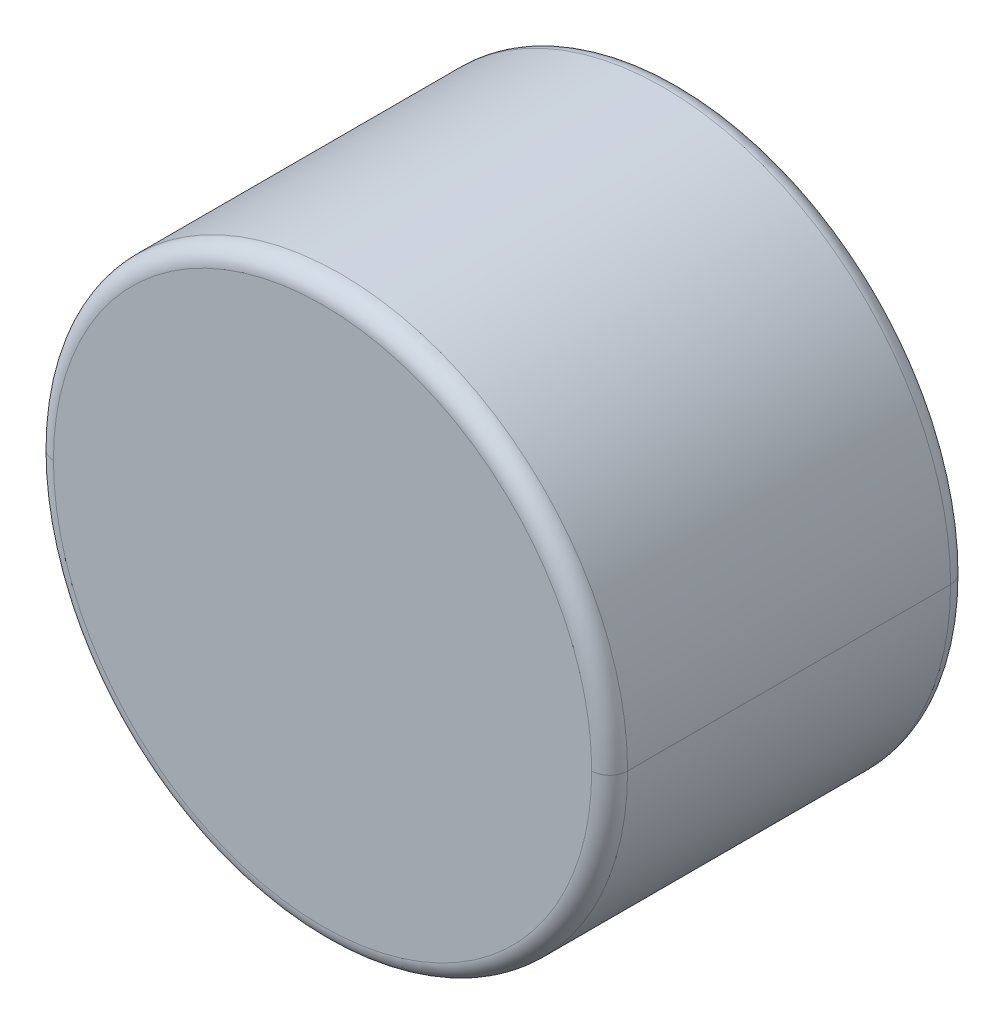
ISO-10303-21;
HEADER;
FILE_DESCRIPTION(('STEP AP214'),'2;1');
FILE_NAME('part.step','',(''),(''),'','','');
FILE_SCHEMA(('AUTOMOTIVE_DESIGN { 1 0 10303 214 1 1 1 1 }'));
ENDSEC;
DATA;
#1=APPLICATION_CONTEXT('core data for automotive mechanical design processes');
#2=APPLICATION_PROTOCOL_DEFINITION('international standard','automotive_design',2000,#1);
#3=PRODUCT_CONTEXT('',#1,'mechanical');
#4=PRODUCT('Part','Part','',(#3));
#5=PRODUCT_RELATED_PRODUCT_CATEGORY('part','',(#4));
#6=PRODUCT_DEFINITION_FORMATION('','',#4);
#7=PRODUCT_DEFINITION_CONTEXT('part definition',#1,'design');
#8=PRODUCT_DEFINITION('design','',#6,#7);
#9=PRODUCT_DEFINITION_SHAPE('','',#8);
#10=(LENGTH_UNIT() NAMED_UNIT(*) SI_UNIT(.MILLI.,.METRE.));
#11=(NAMED_UNIT(*) PLANE_ANGLE_UNIT() SI_UNIT($,.RADIAN.));
#12=(NAMED_UNIT(*) SI_UNIT($,.STERADIAN.) SOLID_ANGLE_UNIT());
#13=UNCERTAINTY_MEASURE_WITH_UNIT(LENGTH_MEASURE(1.E-05),#10,'distance_accuracy_value','');
#14=(GEOMETRIC_REPRESENTATION_CONTEXT(3) GLOBAL_UNCERTAINTY_ASSIGNED_CONTEXT((#13)) GLOBAL_UNIT_ASSIGNED_CONTEXT((#10,
#11,#12)) REPRESENTATION_CONTEXT('',''));
#15=CARTESIAN_POINT('',(0.,0.,0.));
#16=DIRECTION('',(0.,0.,1.));
#17=DIRECTION('',(1.,0.,0.));
#18=AXIS2_PLACEMENT_3D('',#15,#16,#17);
#19=CARTESIAN_POINT('',(0.,0.,2.25));
#20=DIRECTION('',(0.,0.,1.));
#21=DIRECTION('',(1.,0.,0.));
#22=AXIS2_PLACEMENT_3D('',#19,#20,#21);
#23=TOROIDAL_SURFACE('',#22,3.75,0.25);
#24=CARTESIAN_POINT('',(-3.75,0.,2.25));
#25=DIRECTION('',(0.,1.,0.));
#26=DIRECTION('',(-1.,0.,0.));
#27=AXIS2_PLACEMENT_3D('',#24,#25,#26);
#28=CIRCLE('',#27,0.25);
#29=CARTESIAN_POINT('',(-4.,0.,2.25));
#30=VERTEX_POINT('',#29);
#31=CARTESIAN_POINT('',(-3.75,0.,2.5));
#32=VERTEX_POINT('',#31);
#33=EDGE_CURVE('E101',#30,#32,#28,.T.);
#34=ORIENTED_EDGE('',*,*,#33,.F.);
#35=CARTESIAN_POINT('',(0.,0.,2.25));
#36=DIRECTION('',(0.,0.,-1.));
#37=DIRECTION('',(1.,0.,0.));
#38=AXIS2_PLACEMENT_3D('',#35,#36,#37);
#39=CIRCLE('',#38,4.);
#40=CARTESIAN_POINT('',(4.,0.,2.25));
#41=VERTEX_POINT('',#40);
#42=EDGE_CURVE('E77',#41,#30,#39,.T.);
#43=ORIENTED_EDGE('',*,*,#42,.F.);
#44=CARTESIAN_POINT('',(3.75,0.,2.25));
#45=DIRECTION('',(0.,-1.,0.));
#46=DIRECTION('',(0.,0.,-1.));
#47=AXIS2_PLACEMENT_3D('',#44,#45,#46);
#48=CIRCLE('',#47,0.25);
#49=CARTESIAN_POINT('',(3.75,0.,2.5));
#50=VERTEX_POINT('',#49);
#51=EDGE_CURVE('E107',#41,#50,#48,.T.);
#52=ORIENTED_EDGE('',*,*,#51,.T.);
#53=CARTESIAN_POINT('',(0.,0.,2.5));
#54=DIRECTION('',(0.,0.,1.));
#55=DIRECTION('',(1.,0.,0.));
#56=AXIS2_PLACEMENT_3D('',#53,#54,#55);
#57=CIRCLE('',#56,3.75);
#58=EDGE_CURVE('E27',#32,#50,#57,.T.);
#59=ORIENTED_EDGE('',*,*,#58,.F.);
#60=EDGE_LOOP('',(#34,#43,#52,#59));
#61=FACE_BOUND('',#60,.T.);
#62=ADVANCED_FACE('F16',(#61),#23,.T.);
#63=CARTESIAN_POINT('',(0.,0.,-2.25));
#64=DIRECTION('',(0.,0.,1.));
#65=DIRECTION('',(1.,0.,0.));
#66=AXIS2_PLACEMENT_3D('',#63,#64,#65);
#67=TOROIDAL_SURFACE('',#66,3.75,0.25);
#68=CARTESIAN_POINT('',(-3.75,0.,-2.25));
#69=DIRECTION('',(0.,1.,0.));
#70=DIRECTION('',(-1.,0.,0.));
#71=AXIS2_PLACEMENT_3D('',#68,#69,#70);
#72=CIRCLE('',#71,0.25);
#73=CARTESIAN_POINT('',(-3.75,0.,-2.5));
#74=VERTEX_POINT('',#73);
#75=CARTESIAN_POINT('',(-4.,0.,-2.25));
#76=VERTEX_POINT('',#75);
#77=EDGE_CURVE('E120',#74,#76,#72,.T.);
#78=ORIENTED_EDGE('',*,*,#77,.F.);
#79=CARTESIAN_POINT('',(0.,0.,-2.5));
#80=DIRECTION('',(0.,0.,-1.));
#81=DIRECTION('',(1.,0.,0.));
#82=AXIS2_PLACEMENT_3D('',#79,#80,#81);
#83=CIRCLE('',#82,3.75);
#84=CARTESIAN_POINT('',(3.75,0.,-2.5));
#85=VERTEX_POINT('',#84);
#86=EDGE_CURVE('E11',#85,#74,#83,.T.);
#87=ORIENTED_EDGE('',*,*,#86,.F.);
#88=CARTESIAN_POINT('',(3.75,0.,-2.25));
#89=DIRECTION('',(0.,-1.,0.));
#90=DIRECTION('',(0.,0.,-1.));
#91=AXIS2_PLACEMENT_3D('',#88,#89,#90);
#92=CIRCLE('',#91,0.25);
#93=CARTESIAN_POINT('',(4.,0.,-2.25));
#94=VERTEX_POINT('',#93);
#95=EDGE_CURVE('E117',#85,#94,#92,.T.);
#96=ORIENTED_EDGE('',*,*,#95,.T.);
#97=CARTESIAN_POINT('',(0.,0.,-2.25));
#98=DIRECTION('',(0.,0.,1.));
#99=DIRECTION('',(1.,0.,0.));
#100=AXIS2_PLACEMENT_3D('',#97,#98,#99);
#101=CIRCLE('',#100,4.);
#102=EDGE_CURVE('E42',#76,#94,#101,.T.);
#103=ORIENTED_EDGE('',*,*,#102,.F.);
#104=EDGE_LOOP('',(#78,#87,#96,#103));
#105=FACE_BOUND('',#104,.T.);
#106=ADVANCED_FACE('F142',(#105),#67,.T.);
#107=CARTESIAN_POINT('',(0.,0.,-2.5));
#108=DIRECTION('',(0.,0.,1.));
#109=DIRECTION('',(1.,0.,0.));
#110=AXIS2_PLACEMENT_3D('',#107,#108,#109);
#111=PLANE('',#110);
#112=ORIENTED_EDGE('',*,*,#86,.T.);
#113=CARTESIAN_POINT('',(0.,0.,-2.5));
#114=DIRECTION('',(0.,0.,-1.));
#115=DIRECTION('',(1.,0.,0.));
#116=AXIS2_PLACEMENT_3D('',#113,#114,#115);
#117=CIRCLE('',#116,3.75);
#118=EDGE_CURVE('E125',#74,#85,#117,.T.);
#119=ORIENTED_EDGE('',*,*,#118,.T.);
#120=EDGE_LOOP('',(#112,#119));
#121=FACE_BOUND('',#120,.T.);
#122=ADVANCED_FACE('F158',(#121),#111,.F.);
#123=CARTESIAN_POINT('',(0.,0.,2.5));
#124=DIRECTION('',(0.,0.,1.));
#125=DIRECTION('',(1.,0.,0.));
#126=AXIS2_PLACEMENT_3D('',#123,#124,#125);
#127=PLANE('',#126);
#128=CARTESIAN_POINT('',(0.,0.,2.5));
#129=DIRECTION('',(0.,0.,1.));
#130=DIRECTION('',(1.,0.,0.));
#131=AXIS2_PLACEMENT_3D('',#128,#129,#130);
#132=CIRCLE('',#131,3.75);
#133=EDGE_CURVE('E20',#50,#32,#132,.T.);
#134=ORIENTED_EDGE('',*,*,#133,.T.);
#135=ORIENTED_EDGE('',*,*,#58,.T.);
#136=EDGE_LOOP('',(#134,#135));
#137=FACE_BOUND('',#136,.T.);
#138=ADVANCED_FACE('F18',(#137),#127,.T.);
#139=CARTESIAN_POINT('',(0.,0.,2.5));
#140=DIRECTION('',(0.,0.,-1.));
#141=DIRECTION('',(-1.,0.,0.));
#142=AXIS2_PLACEMENT_3D('',#139,#140,#141);
#143=CYLINDRICAL_SURFACE('',#142,4.);
#144=DIRECTION('',(0.,0.,-1.));
#145=VECTOR('',#144,1.);
#146=CARTESIAN_POINT('',(4.,0.,2.5));
#147=LINE('',#146,#145);
#148=EDGE_CURVE('E86',#41,#94,#147,.T.);
#149=ORIENTED_EDGE('',*,*,#148,.F.);
#150=ORIENTED_EDGE('',*,*,#42,.T.);
#151=DIRECTION('',(0.,0.,-1.));
#152=VECTOR('',#151,1.);
#153=CARTESIAN_POINT('',(-4.,0.,2.5));
#154=LINE('',#153,#152);
#155=EDGE_CURVE('E84',#30,#76,#154,.T.);
#156=ORIENTED_EDGE('',*,*,#155,.T.);
#157=ORIENTED_EDGE('',*,*,#102,.T.);
#158=EDGE_LOOP('',(#149,#150,#156,#157));
#159=FACE_BOUND('',#158,.T.);
#160=ADVANCED_FACE('F83',(#159),#143,.T.);
#161=CARTESIAN_POINT('',(0.,0.,2.5));
#162=DIRECTION('',(0.,0.,-1.));
#163=DIRECTION('',(-1.,0.,0.));
#164=AXIS2_PLACEMENT_3D('',#161,#162,#163);
#165=CYLINDRICAL_SURFACE('',#164,4.);
#166=CARTESIAN_POINT('',(0.,0.,2.25));
#167=DIRECTION('',(0.,0.,-1.));
#168=DIRECTION('',(1.,0.,0.));
#169=AXIS2_PLACEMENT_3D('',#166,#167,#168);
#170=CIRCLE('',#169,4.);
#171=EDGE_CURVE('E94',#30,#41,#170,.T.);
#172=ORIENTED_EDGE('',*,*,#171,.T.);
#173=ORIENTED_EDGE('',*,*,#148,.T.);
#174=CARTESIAN_POINT('',(0.,0.,-2.25));
#175=DIRECTION('',(0.,0.,1.));
#176=DIRECTION('',(1.,0.,0.));
#177=AXIS2_PLACEMENT_3D('',#174,#175,#176);
#178=CIRCLE('',#177,4.);
#179=EDGE_CURVE('E96',#94,#76,#178,.T.);
#180=ORIENTED_EDGE('',*,*,#179,.T.);
#181=ORIENTED_EDGE('',*,*,#155,.F.);
#182=EDGE_LOOP('',(#172,#173,#180,#181));
#183=FACE_BOUND('',#182,.T.);
#184=ADVANCED_FACE('F92',(#183),#165,.T.);
#185=CARTESIAN_POINT('',(0.,0.,-2.25));
#186=DIRECTION('',(0.,0.,1.));
#187=DIRECTION('',(1.,0.,0.));
#188=AXIS2_PLACEMENT_3D('',#185,#186,#187);
#189=TOROIDAL_SURFACE('',#188,3.75,0.25);
#190=ORIENTED_EDGE('',*,*,#118,.F.);
#191=ORIENTED_EDGE('',*,*,#77,.T.);
#192=ORIENTED_EDGE('',*,*,#179,.F.);
#193=ORIENTED_EDGE('',*,*,#95,.F.);
#194=EDGE_LOOP('',(#190,#191,#192,#193));
#195=FACE_BOUND('',#194,.T.);
#196=ADVANCED_FACE('F143',(#195),#189,.T.);
#197=CARTESIAN_POINT('',(0.,0.,2.25));
#198=DIRECTION('',(0.,0.,1.));
#199=DIRECTION('',(1.,0.,0.));
#200=AXIS2_PLACEMENT_3D('',#197,#198,#199);
#201=TOROIDAL_SURFACE('',#200,3.75,0.25);
#202=ORIENTED_EDGE('',*,*,#171,.F.);
#203=ORIENTED_EDGE('',*,*,#33,.T.);
#204=ORIENTED_EDGE('',*,*,#133,.F.);
#205=ORIENTED_EDGE('',*,*,#51,.F.);
#206=EDGE_LOOP('',(#202,#203,#204,#205));
#207=FACE_BOUND('',#206,.T.);
#208=ADVANCED_FACE('F106',(#207),#201,.T.);
#209=CLOSED_SHELL('',(#62,#106,#122,#138,#160,#184,#196,#208));
#210=MANIFOLD_SOLID_BREP('B1',#209);
#211=ADVANCED_BREP_SHAPE_REPRESENTATION('',(#18,#210),#14);
#212=SHAPE_DEFINITION_REPRESENTATION(#9,#211);
ENDSEC;
END-ISO-10303-21;
